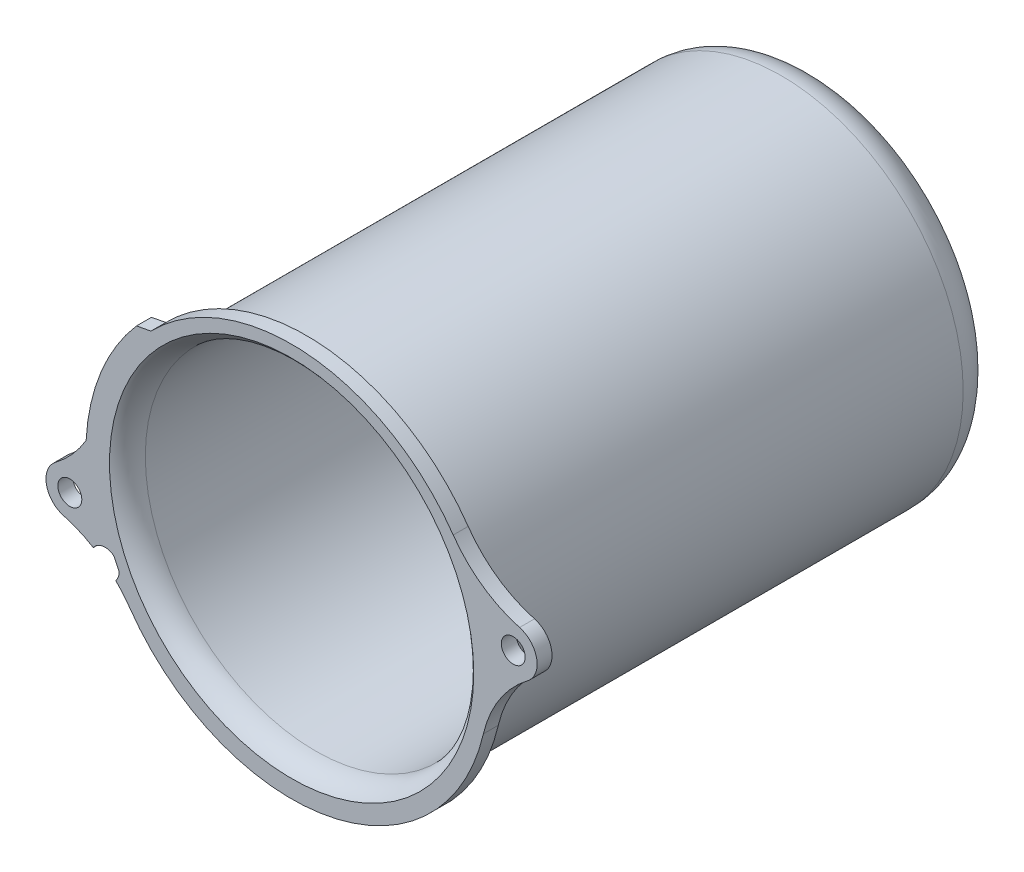
ISO-10303-21;
HEADER;
FILE_DESCRIPTION(('STEP AP214'),'2;1');
FILE_NAME('part.step','',(''),(''),'','','');
FILE_SCHEMA(('AUTOMOTIVE_DESIGN { 1 0 10303 214 1 1 1 1 }'));
ENDSEC;
DATA;
#1=APPLICATION_CONTEXT('core data for automotive mechanical design processes');
#2=APPLICATION_PROTOCOL_DEFINITION('international standard','automotive_design',2000,#1);
#3=PRODUCT_CONTEXT('',#1,'mechanical');
#4=PRODUCT('Part','Part','',(#3));
#5=PRODUCT_RELATED_PRODUCT_CATEGORY('part','',(#4));
#6=PRODUCT_DEFINITION_FORMATION('','',#4);
#7=PRODUCT_DEFINITION_CONTEXT('part definition',#1,'design');
#8=PRODUCT_DEFINITION('design','',#6,#7);
#9=PRODUCT_DEFINITION_SHAPE('','',#8);
#10=(LENGTH_UNIT() NAMED_UNIT(*) SI_UNIT(.MILLI.,.METRE.));
#11=(NAMED_UNIT(*) PLANE_ANGLE_UNIT() SI_UNIT($,.RADIAN.));
#12=(NAMED_UNIT(*) SI_UNIT($,.STERADIAN.) SOLID_ANGLE_UNIT());
#13=UNCERTAINTY_MEASURE_WITH_UNIT(LENGTH_MEASURE(1.E-05),#10,'distance_accuracy_value','');
#14=(GEOMETRIC_REPRESENTATION_CONTEXT(3) GLOBAL_UNCERTAINTY_ASSIGNED_CONTEXT((#13)) GLOBAL_UNIT_ASSIGNED_CONTEXT((#10,
#11,#12)) REPRESENTATION_CONTEXT('',''));
#15=CARTESIAN_POINT('',(0.,0.,0.));
#16=DIRECTION('',(0.,0.,1.));
#17=DIRECTION('',(1.,0.,0.));
#18=AXIS2_PLACEMENT_3D('',#15,#16,#17);
#19=CARTESIAN_POINT('',(37.1314984061191,7.1452296563436,0.));
#20=DIRECTION('',(0.,0.,1.));
#21=DIRECTION('',(1.,0.,0.));
#22=AXIS2_PLACEMENT_3D('',#19,#20,#21);
#23=PLANE('',#22);
#24=CARTESIAN_POINT('',(-37.1557425862573,-7.11096578016195,0.));
#25=DIRECTION('',(0.,0.,-1.));
#26=DIRECTION('',(-1.,0.,0.));
#27=AXIS2_PLACEMENT_3D('',#24,#25,#26);
#28=CIRCLE('',#27,2.);
#29=CARTESIAN_POINT('',(-39.1557425862573,-7.11096578016195,0.));
#30=VERTEX_POINT('',#29);
#31=EDGE_CURVE('E171',#30,#30,#28,.T.);
#32=ORIENTED_EDGE('',*,*,#31,.F.);
#33=EDGE_LOOP('',(#32));
#34=FACE_BOUND('',#33,.T.);
#35=CARTESIAN_POINT('',(37.1314984061191,7.1452296563436,0.));
#36=DIRECTION('',(0.,0.,1.));
#37=DIRECTION('',(1.,0.,0.));
#38=AXIS2_PLACEMENT_3D('',#35,#36,#37);
#39=CIRCLE('',#38,2.);
#40=CARTESIAN_POINT('',(39.1314984061191,7.1452296563436,0.));
#41=VERTEX_POINT('',#40);
#42=EDGE_CURVE('E159',#41,#41,#39,.T.);
#43=ORIENTED_EDGE('',*,*,#42,.T.);
#44=EDGE_LOOP('',(#43));
#45=FACE_BOUND('',#44,.T.);
#46=CARTESIAN_POINT('',(-31.2603609977853,-14.448814942743,0.));
#47=DIRECTION('',(0.,0.,1.));
#48=DIRECTION('',(1.,0.,0.));
#49=AXIS2_PLACEMENT_3D('',#46,#47,#48);
#50=CIRCLE('',#49,2.37047257493352);
#51=CARTESIAN_POINT('',(-29.4766622936871,-16.0100833890746,0.));
#52=VERTEX_POINT('',#51);
#53=CARTESIAN_POINT('',(-28.8900823285085,-14.4184956669679,0.));
#54=VERTEX_POINT('',#53);
#55=EDGE_CURVE('E197',#52,#54,#50,.T.);
#56=ORIENTED_EDGE('',*,*,#55,.T.);
#57=CARTESIAN_POINT('',(0.,0.490000000000017,0.));
#58=DIRECTION('',(0.,0.,1.));
#59=DIRECTION('',(1.,0.,0.));
#60=AXIS2_PLACEMENT_3D('',#57,#58,#59);
#61=CIRCLE('',#60,32.51);
#62=CARTESIAN_POINT('',(-29.7478317506265,-12.6236038576897,0.));
#63=VERTEX_POINT('',#62);
#64=EDGE_CURVE('E156',#63,#54,#61,.T.);
#65=ORIENTED_EDGE('',*,*,#64,.F.);
#66=CARTESIAN_POINT('',(-33.216253111935,-13.1095516130282,0.));
#67=VERTEX_POINT('',#66);
#68=EDGE_CURVE('E49',#63,#67,#50,.T.);
#69=ORIENTED_EDGE('',*,*,#68,.T.);
#70=CARTESIAN_POINT('',(-43.517994945261,-30.2523085441494,0.));
#71=DIRECTION('',(0.,0.,-1.));
#72=DIRECTION('',(-1.,0.,0.));
#73=AXIS2_PLACEMENT_3D('',#70,#71,#72);
#74=CIRCLE('',#73,20.);
#75=CARTESIAN_POINT('',(-38.2161179794246,-10.9678562408265,0.));
#76=VERTEX_POINT('',#75);
#77=EDGE_CURVE('E196',#76,#67,#74,.T.);
#78=ORIENTED_EDGE('',*,*,#77,.F.);
#79=CARTESIAN_POINT('',(-37.1557425862573,-7.11096578016195,0.));
#80=DIRECTION('',(0.,0.,-1.));
#81=DIRECTION('',(-1.,0.,0.));
#82=AXIS2_PLACEMENT_3D('',#79,#80,#81);
#83=CIRCLE('',#82,4.00000000000001);
#84=CARTESIAN_POINT('',(-39.5685318355066,-3.9205977702441,0.));
#85=VERTEX_POINT('',#84);
#86=EDGE_CURVE('E193',#76,#85,#83,.T.);
#87=ORIENTED_EDGE('',*,*,#86,.T.);
#88=CARTESIAN_POINT('',(-51.632478081753,12.0312422793451,0.));
#89=DIRECTION('',(0.,0.,1.));
#90=DIRECTION('',(1.,0.,0.));
#91=AXIS2_PLACEMENT_3D('',#88,#89,#90);
#92=CIRCLE('',#91,20.);
#93=CARTESIAN_POINT('',(-34.4270577265697,1.83450209429344,0.));
#94=VERTEX_POINT('',#93);
#95=EDGE_CURVE('E190',#85,#94,#92,.T.);
#96=ORIENTED_EDGE('',*,*,#95,.T.);
#97=CARTESIAN_POINT('',(-0.0121220900691226,0.0171319380908276,0.));
#98=DIRECTION('',(0.,0.,1.));
#99=DIRECTION('',(1.,0.,0.));
#100=AXIS2_PLACEMENT_3D('',#97,#98,#99);
#101=CIRCLE('',#100,34.4628877076361);
#102=CARTESIAN_POINT('',(-25.9858462517282,22.667877672463,0.));
#103=VERTEX_POINT('',#102);
#104=EDGE_CURVE('E187',#103,#94,#101,.T.);
#105=ORIENTED_EDGE('',*,*,#104,.F.);
#106=DIRECTION('',(-0.982414788855159,-0.186711495732516,0.));
#107=VECTOR('',#106,1.);
#108=CARTESIAN_POINT('',(-23.568944798703,23.1272185643671,0.));
#109=LINE('',#108,#107);
#110=CARTESIAN_POINT('',(-23.568944798703,23.1272185643671,0.));
#111=VERTEX_POINT('',#110);
#112=EDGE_CURVE('E184',#111,#103,#109,.T.);
#113=ORIENTED_EDGE('',*,*,#112,.F.);
#114=CARTESIAN_POINT('',(-0.0121220900691226,0.0171319380908276,0.));
#115=DIRECTION('',(0.,0.,1.));
#116=DIRECTION('',(1.,0.,0.));
#117=AXIS2_PLACEMENT_3D('',#114,#115,#116);
#118=CIRCLE('',#117,33.);
#119=CARTESIAN_POINT('',(27.0764402537296,18.8641420496743,0.));
#120=VERTEX_POINT('',#119);
#121=EDGE_CURVE('E183',#120,#111,#118,.T.);
#122=ORIENTED_EDGE('',*,*,#121,.F.);
#123=CARTESIAN_POINT('',(43.4937507651227,30.286572420331,0.));
#124=DIRECTION('',(0.,0.,-1.));
#125=DIRECTION('',(-1.,0.,0.));
#126=AXIS2_PLACEMENT_3D('',#123,#124,#125);
#127=CIRCLE('',#126,20.);
#128=CARTESIAN_POINT('',(38.1918737992863,11.0021201170082,0.));
#129=VERTEX_POINT('',#128);
#130=EDGE_CURVE('E180',#129,#120,#127,.T.);
#131=ORIENTED_EDGE('',*,*,#130,.F.);
#132=CARTESIAN_POINT('',(37.1314984061191,7.1452296563436,0.));
#133=DIRECTION('',(0.,0.,1.));
#134=DIRECTION('',(1.,0.,0.));
#135=AXIS2_PLACEMENT_3D('',#132,#133,#134);
#136=CIRCLE('',#135,4.00000000000001);
#137=CARTESIAN_POINT('',(39.5442876553683,3.95486164642576,0.));
#138=VERTEX_POINT('',#137);
#139=EDGE_CURVE('E177',#138,#129,#136,.T.);
#140=ORIENTED_EDGE('',*,*,#139,.F.);
#141=CARTESIAN_POINT('',(51.6082339016147,-11.9969784031634,0.));
#142=DIRECTION('',(0.,0.,1.));
#143=DIRECTION('',(1.,0.,0.));
#144=AXIS2_PLACEMENT_3D('',#141,#142,#143);
#145=CIRCLE('',#144,20.);
#146=CARTESIAN_POINT('',(32.1288542821114,-7.46335185929391,0.));
#147=VERTEX_POINT('',#146);
#148=EDGE_CURVE('E205',#138,#147,#145,.T.);
#149=ORIENTED_EDGE('',*,*,#148,.T.);
#150=CARTESIAN_POINT('',(-27.1006844338678,-18.8298781734927,0.));
#151=VERTEX_POINT('',#150);
#152=EDGE_CURVE('E202',#151,#147,#118,.T.);
#153=ORIENTED_EDGE('',*,*,#152,.F.);
#154=EDGE_CURVE('E199',#52,#151,#74,.T.);
#155=ORIENTED_EDGE('',*,*,#154,.F.);
#156=EDGE_LOOP('',(#56,#65,#69,#78,#87,#96,#105,#113,#122,#131,#140,#149,#153,#155));
#157=FACE_BOUND('',#156,.T.);
#158=CARTESIAN_POINT('',(0.,0.490000000000018,0.));
#159=DIRECTION('',(0.,0.,1.));
#160=DIRECTION('',(1.,0.,0.));
#161=AXIS2_PLACEMENT_3D('',#158,#159,#160);
#162=CIRCLE('',#161,32.01);
#163=CARTESIAN_POINT('',(32.01,0.490000000000018,0.));
#164=VERTEX_POINT('',#163);
#165=EDGE_CURVE('E11',#164,#164,#162,.F.);
#166=ORIENTED_EDGE('',*,*,#165,.F.);
#167=EDGE_LOOP('',(#166));
#168=FACE_BOUND('',#167,.T.);
#169=ADVANCED_FACE('F34',(#34,#45,#157,#168),#23,.F.);
#170=CARTESIAN_POINT('',(-31.2603609977853,-14.448814942743,2.5));
#171=DIRECTION('',(0.,0.,-1.));
#172=DIRECTION('',(-1.,0.,0.));
#173=AXIS2_PLACEMENT_3D('',#170,#171,#172);
#174=CYLINDRICAL_SURFACE('',#173,2.37047257493352);
#175=CARTESIAN_POINT('',(-31.2603609977853,-14.448814942743,2.5));
#176=DIRECTION('',(0.,0.,1.));
#177=DIRECTION('',(1.,0.,0.));
#178=AXIS2_PLACEMENT_3D('',#175,#176,#177);
#179=CIRCLE('',#178,2.37047257493352);
#180=CARTESIAN_POINT('',(-29.4766622936871,-16.0100833890746,2.5));
#181=VERTEX_POINT('',#180);
#182=CARTESIAN_POINT('',(-28.8900823285085,-14.4184956669679,2.5));
#183=VERTEX_POINT('',#182);
#184=EDGE_CURVE('E146',#181,#183,#179,.T.);
#185=ORIENTED_EDGE('',*,*,#184,.T.);
#186=DIRECTION('',(0.,0.,1.));
#187=VECTOR('',#186,1.);
#188=CARTESIAN_POINT('',(-28.8900823285085,-14.4184956669679,1.24999999999998));
#189=LINE('',#188,#187);
#190=EDGE_CURVE('E42',#183,#54,#189,.F.);
#191=ORIENTED_EDGE('',*,*,#190,.T.);
#192=ORIENTED_EDGE('',*,*,#55,.F.);
#193=DIRECTION('',(0.,0.,-1.));
#194=VECTOR('',#193,1.);
#195=CARTESIAN_POINT('',(-29.4766622936871,-16.0100833890746,2.5));
#196=LINE('',#195,#194);
#197=EDGE_CURVE('E242',#181,#52,#196,.T.);
#198=ORIENTED_EDGE('',*,*,#197,.F.);
#199=EDGE_LOOP('',(#185,#191,#192,#198));
#200=FACE_BOUND('',#199,.T.);
#201=ADVANCED_FACE('F288',(#200),#174,.F.);
#202=ORIENTED_EDGE('',*,*,#68,.F.);
#203=DIRECTION('',(0.,0.,1.));
#204=VECTOR('',#203,1.);
#205=CARTESIAN_POINT('',(-29.7478317506265,-12.6236038576897,1.24999999999998));
#206=LINE('',#205,#204);
#207=CARTESIAN_POINT('',(-29.7478317506266,-12.6236038576897,2.49999999999997));
#208=VERTEX_POINT('',#207);
#209=EDGE_CURVE('E148',#63,#208,#206,.T.);
#210=ORIENTED_EDGE('',*,*,#209,.T.);
#211=CARTESIAN_POINT('',(-33.216253111935,-13.1095516130282,2.5));
#212=VERTEX_POINT('',#211);
#213=EDGE_CURVE('E136',#208,#212,#179,.T.);
#214=ORIENTED_EDGE('',*,*,#213,.T.);
#215=DIRECTION('',(0.,0.,-1.));
#216=VECTOR('',#215,1.);
#217=CARTESIAN_POINT('',(-33.216253111935,-13.1095516130282,2.5));
#218=LINE('',#217,#216);
#219=EDGE_CURVE('E244',#212,#67,#218,.T.);
#220=ORIENTED_EDGE('',*,*,#219,.T.);
#221=EDGE_LOOP('',(#202,#210,#214,#220));
#222=FACE_BOUND('',#221,.T.);
#223=ADVANCED_FACE('F149',(#222),#174,.F.);
#224=CARTESIAN_POINT('',(37.1314984061191,7.1452296563436,2.5));
#225=DIRECTION('',(0.,0.,1.));
#226=DIRECTION('',(1.,0.,0.));
#227=AXIS2_PLACEMENT_3D('',#224,#225,#226);
#228=PLANE('',#227);
#229=CARTESIAN_POINT('',(0.,0.490000000000017,2.49999999999997));
#230=DIRECTION('',(0.,0.,1.));
#231=DIRECTION('',(1.,0.,0.));
#232=AXIS2_PLACEMENT_3D('',#229,#230,#231);
#233=CIRCLE('',#232,32.51);
#234=EDGE_CURVE('E141',#208,#183,#233,.T.);
#235=ORIENTED_EDGE('',*,*,#234,.T.);
#236=ORIENTED_EDGE('',*,*,#184,.F.);
#237=CARTESIAN_POINT('',(-43.517994945261,-30.2523085441494,2.5));
#238=DIRECTION('',(0.,0.,-1.));
#239=DIRECTION('',(-1.,0.,0.));
#240=AXIS2_PLACEMENT_3D('',#237,#238,#239);
#241=CIRCLE('',#240,20.);
#242=CARTESIAN_POINT('',(-27.1006844338678,-18.8298781734927,2.5));
#243=VERTEX_POINT('',#242);
#244=EDGE_CURVE('E227',#181,#243,#241,.T.);
#245=ORIENTED_EDGE('',*,*,#244,.T.);
#246=CARTESIAN_POINT('',(-0.0121220900691226,0.0171319380908276,2.5));
#247=DIRECTION('',(0.,0.,1.));
#248=DIRECTION('',(1.,0.,0.));
#249=AXIS2_PLACEMENT_3D('',#246,#247,#248);
#250=CIRCLE('',#249,33.);
#251=CARTESIAN_POINT('',(32.1288542821114,-7.46335185929391,2.5));
#252=VERTEX_POINT('',#251);
#253=EDGE_CURVE('E230',#243,#252,#250,.T.);
#254=ORIENTED_EDGE('',*,*,#253,.T.);
#255=CARTESIAN_POINT('',(51.6082339016147,-11.9969784031634,2.5));
#256=DIRECTION('',(0.,0.,1.));
#257=DIRECTION('',(1.,0.,0.));
#258=AXIS2_PLACEMENT_3D('',#255,#256,#257);
#259=CIRCLE('',#258,20.);
#260=CARTESIAN_POINT('',(39.5442876553683,3.95486164642576,2.5));
#261=VERTEX_POINT('',#260);
#262=EDGE_CURVE('E233',#261,#252,#259,.T.);
#263=ORIENTED_EDGE('',*,*,#262,.F.);
#264=CARTESIAN_POINT('',(37.1314984061191,7.1452296563436,2.5));
#265=DIRECTION('',(0.,0.,1.));
#266=DIRECTION('',(1.,0.,0.));
#267=AXIS2_PLACEMENT_3D('',#264,#265,#266);
#268=CIRCLE('',#267,4.00000000000001);
#269=CARTESIAN_POINT('',(38.1918737992863,11.0021201170082,2.5));
#270=VERTEX_POINT('',#269);
#271=EDGE_CURVE('E208',#261,#270,#268,.T.);
#272=ORIENTED_EDGE('',*,*,#271,.T.);
#273=CARTESIAN_POINT('',(43.4937507651227,30.286572420331,2.5));
#274=DIRECTION('',(0.,0.,-1.));
#275=DIRECTION('',(-1.,0.,0.));
#276=AXIS2_PLACEMENT_3D('',#273,#274,#275);
#277=CIRCLE('',#276,20.);
#278=CARTESIAN_POINT('',(27.0764402537296,18.8641420496743,2.5));
#279=VERTEX_POINT('',#278);
#280=EDGE_CURVE('E211',#270,#279,#277,.T.);
#281=ORIENTED_EDGE('',*,*,#280,.T.);
#282=CARTESIAN_POINT('',(-23.568944798703,23.1272185643671,2.5));
#283=VERTEX_POINT('',#282);
#284=EDGE_CURVE('E214',#279,#283,#250,.T.);
#285=ORIENTED_EDGE('',*,*,#284,.T.);
#286=DIRECTION('',(-0.982414788855159,-0.186711495732516,0.));
#287=VECTOR('',#286,1.);
#288=CARTESIAN_POINT('',(-23.568944798703,23.1272185643671,2.5));
#289=LINE('',#288,#287);
#290=CARTESIAN_POINT('',(-25.9858462517282,22.667877672463,2.5));
#291=VERTEX_POINT('',#290);
#292=EDGE_CURVE('E215',#283,#291,#289,.T.);
#293=ORIENTED_EDGE('',*,*,#292,.T.);
#294=CARTESIAN_POINT('',(-0.0121220900691226,0.0171319380908276,2.5));
#295=DIRECTION('',(0.,0.,1.));
#296=DIRECTION('',(1.,0.,0.));
#297=AXIS2_PLACEMENT_3D('',#294,#295,#296);
#298=CIRCLE('',#297,34.4628877076361);
#299=CARTESIAN_POINT('',(-34.4270577265697,1.83450209429344,2.5));
#300=VERTEX_POINT('',#299);
#301=EDGE_CURVE('E218',#291,#300,#298,.T.);
#302=ORIENTED_EDGE('',*,*,#301,.T.);
#303=CARTESIAN_POINT('',(-51.632478081753,12.0312422793451,2.5));
#304=DIRECTION('',(0.,0.,1.));
#305=DIRECTION('',(1.,0.,0.));
#306=AXIS2_PLACEMENT_3D('',#303,#304,#305);
#307=CIRCLE('',#306,20.);
#308=CARTESIAN_POINT('',(-39.5685318355066,-3.9205977702441,2.5));
#309=VERTEX_POINT('',#308);
#310=EDGE_CURVE('E221',#309,#300,#307,.T.);
#311=ORIENTED_EDGE('',*,*,#310,.F.);
#312=CARTESIAN_POINT('',(-37.1557425862573,-7.11096578016195,2.5));
#313=DIRECTION('',(0.,0.,-1.));
#314=DIRECTION('',(-1.,0.,0.));
#315=AXIS2_PLACEMENT_3D('',#312,#313,#314);
#316=CIRCLE('',#315,4.00000000000001);
#317=CARTESIAN_POINT('',(-38.2161179794246,-10.9678562408265,2.5));
#318=VERTEX_POINT('',#317);
#319=EDGE_CURVE('E224',#318,#309,#316,.T.);
#320=ORIENTED_EDGE('',*,*,#319,.F.);
#321=EDGE_CURVE('E144',#318,#212,#241,.T.);
#322=ORIENTED_EDGE('',*,*,#321,.T.);
#323=ORIENTED_EDGE('',*,*,#213,.F.);
#324=EDGE_LOOP('',(#235,#236,#245,#254,#263,#272,#281,#285,#293,#302,#311,#320,#322,#323));
#325=FACE_BOUND('',#324,.T.);
#326=CARTESIAN_POINT('',(0.,0.490000000000017,2.49999999999997));
#327=DIRECTION('',(0.,0.,1.));
#328=DIRECTION('',(1.,0.,0.));
#329=AXIS2_PLACEMENT_3D('',#326,#327,#328);
#330=CIRCLE('',#329,30.51);
#331=CARTESIAN_POINT('',(30.51,0.490000000000017,2.49999999999997));
#332=VERTEX_POINT('',#331);
#333=EDGE_CURVE('E157',#332,#332,#330,.T.);
#334=ORIENTED_EDGE('',*,*,#333,.F.);
#335=EDGE_LOOP('',(#334));
#336=FACE_BOUND('',#335,.T.);
#337=CARTESIAN_POINT('',(-37.1557425862573,-7.11096578016195,2.5));
#338=DIRECTION('',(0.,0.,-1.));
#339=DIRECTION('',(-1.,0.,0.));
#340=AXIS2_PLACEMENT_3D('',#337,#338,#339);
#341=CIRCLE('',#340,2.);
#342=CARTESIAN_POINT('',(-39.1557425862573,-7.11096578016195,2.5));
#343=VERTEX_POINT('',#342);
#344=EDGE_CURVE('E174',#343,#343,#341,.T.);
#345=ORIENTED_EDGE('',*,*,#344,.T.);
#346=EDGE_LOOP('',(#345));
#347=FACE_BOUND('',#346,.T.);
#348=CARTESIAN_POINT('',(37.1314984061191,7.1452296563436,2.5));
#349=DIRECTION('',(0.,0.,1.));
#350=DIRECTION('',(1.,0.,0.));
#351=AXIS2_PLACEMENT_3D('',#348,#349,#350);
#352=CIRCLE('',#351,2.);
#353=CARTESIAN_POINT('',(39.1314984061191,7.1452296563436,2.5));
#354=VERTEX_POINT('',#353);
#355=EDGE_CURVE('E168',#354,#354,#352,.T.);
#356=ORIENTED_EDGE('',*,*,#355,.F.);
#357=EDGE_LOOP('',(#356));
#358=FACE_BOUND('',#357,.T.);
#359=ADVANCED_FACE('F137',(#325,#336,#347,#358),#228,.T.);
#360=CARTESIAN_POINT('',(37.1314984061191,7.1452296563436,2.5));
#361=DIRECTION('',(0.,0.,-1.));
#362=DIRECTION('',(-1.,0.,0.));
#363=AXIS2_PLACEMENT_3D('',#360,#361,#362);
#364=CYLINDRICAL_SURFACE('',#363,4.00000000000001);
#365=DIRECTION('',(0.,0.,-1.));
#366=VECTOR('',#365,1.);
#367=CARTESIAN_POINT('',(38.1918737992863,11.0021201170082,2.5));
#368=LINE('',#367,#366);
#369=EDGE_CURVE('E153',#270,#129,#368,.T.);
#370=ORIENTED_EDGE('',*,*,#369,.F.);
#371=ORIENTED_EDGE('',*,*,#271,.F.);
#372=DIRECTION('',(0.,0.,-1.));
#373=VECTOR('',#372,1.);
#374=CARTESIAN_POINT('',(39.5442876553683,3.95486164642576,2.5));
#375=LINE('',#374,#373);
#376=EDGE_CURVE('E236',#261,#138,#375,.T.);
#377=ORIENTED_EDGE('',*,*,#376,.T.);
#378=ORIENTED_EDGE('',*,*,#139,.T.);
#379=EDGE_LOOP('',(#370,#371,#377,#378));
#380=FACE_BOUND('',#379,.T.);
#381=ADVANCED_FACE('F265',(#380),#364,.T.);
#382=CARTESIAN_POINT('',(43.4937507651227,30.286572420331,2.5));
#383=DIRECTION('',(0.,0.,-1.));
#384=DIRECTION('',(-1.,0.,0.));
#385=AXIS2_PLACEMENT_3D('',#382,#383,#384);
#386=CYLINDRICAL_SURFACE('',#385,20.);
#387=DIRECTION('',(0.,0.,-1.));
#388=VECTOR('',#387,1.);
#389=CARTESIAN_POINT('',(27.0764402537296,18.8641420496743,2.5));
#390=LINE('',#389,#388);
#391=EDGE_CURVE('E256',#279,#120,#390,.T.);
#392=ORIENTED_EDGE('',*,*,#391,.F.);
#393=ORIENTED_EDGE('',*,*,#280,.F.);
#394=ORIENTED_EDGE('',*,*,#369,.T.);
#395=ORIENTED_EDGE('',*,*,#130,.T.);
#396=EDGE_LOOP('',(#392,#393,#394,#395));
#397=FACE_BOUND('',#396,.T.);
#398=ADVANCED_FACE('F36',(#397),#386,.F.);
#399=CARTESIAN_POINT('',(-0.0121220900691226,0.0171319380908276,2.5));
#400=DIRECTION('',(0.,0.,-1.));
#401=DIRECTION('',(-1.,0.,0.));
#402=AXIS2_PLACEMENT_3D('',#399,#400,#401);
#403=CYLINDRICAL_SURFACE('',#402,33.);
#404=DIRECTION('',(0.,0.,-1.));
#405=VECTOR('',#404,1.);
#406=CARTESIAN_POINT('',(-23.568944798703,23.1272185643671,2.5));
#407=LINE('',#406,#405);
#408=EDGE_CURVE('E254',#283,#111,#407,.T.);
#409=ORIENTED_EDGE('',*,*,#408,.F.);
#410=ORIENTED_EDGE('',*,*,#284,.F.);
#411=ORIENTED_EDGE('',*,*,#391,.T.);
#412=ORIENTED_EDGE('',*,*,#121,.T.);
#413=EDGE_LOOP('',(#409,#410,#411,#412));
#414=FACE_BOUND('',#413,.T.);
#415=ADVANCED_FACE('F273',(#414),#403,.T.);
#416=CARTESIAN_POINT('',(-23.568944798703,23.1272185643671,2.5));
#417=DIRECTION('',(0.186711495732516,-0.982414788855159,0.));
#418=DIRECTION('',(0.982414788855159,0.186711495732516,0.));
#419=AXIS2_PLACEMENT_3D('',#416,#417,#418);
#420=PLANE('',#419);
#421=DIRECTION('',(0.,0.,-1.));
#422=VECTOR('',#421,1.);
#423=CARTESIAN_POINT('',(-25.9858462517282,22.667877672463,2.5));
#424=LINE('',#423,#422);
#425=EDGE_CURVE('E252',#291,#103,#424,.T.);
#426=ORIENTED_EDGE('',*,*,#425,.F.);
#427=ORIENTED_EDGE('',*,*,#292,.F.);
#428=ORIENTED_EDGE('',*,*,#408,.T.);
#429=ORIENTED_EDGE('',*,*,#112,.T.);
#430=EDGE_LOOP('',(#426,#427,#428,#429));
#431=FACE_BOUND('',#430,.T.);
#432=ADVANCED_FACE('F304',(#431),#420,.F.);
#433=CARTESIAN_POINT('',(-0.0121220900691226,0.0171319380908276,2.5));
#434=DIRECTION('',(0.,0.,-1.));
#435=DIRECTION('',(-1.,0.,0.));
#436=AXIS2_PLACEMENT_3D('',#433,#434,#435);
#437=CYLINDRICAL_SURFACE('',#436,34.4628877076361);
#438=DIRECTION('',(0.,0.,-1.));
#439=VECTOR('',#438,1.);
#440=CARTESIAN_POINT('',(-34.4270577265697,1.83450209429344,2.5));
#441=LINE('',#440,#439);
#442=EDGE_CURVE('E250',#300,#94,#441,.T.);
#443=ORIENTED_EDGE('',*,*,#442,.F.);
#444=ORIENTED_EDGE('',*,*,#301,.F.);
#445=ORIENTED_EDGE('',*,*,#425,.T.);
#446=ORIENTED_EDGE('',*,*,#104,.T.);
#447=EDGE_LOOP('',(#443,#444,#445,#446));
#448=FACE_BOUND('',#447,.T.);
#449=ADVANCED_FACE('F302',(#448),#437,.T.);
#450=CARTESIAN_POINT('',(-51.632478081753,12.0312422793451,2.5));
#451=DIRECTION('',(0.,0.,-1.));
#452=DIRECTION('',(-1.,0.,0.));
#453=AXIS2_PLACEMENT_3D('',#450,#451,#452);
#454=CYLINDRICAL_SURFACE('',#453,20.);
#455=DIRECTION('',(0.,0.,-1.));
#456=VECTOR('',#455,1.);
#457=CARTESIAN_POINT('',(-39.5685318355066,-3.9205977702441,2.5));
#458=LINE('',#457,#456);
#459=EDGE_CURVE('E248',#309,#85,#458,.T.);
#460=ORIENTED_EDGE('',*,*,#459,.F.);
#461=ORIENTED_EDGE('',*,*,#310,.T.);
#462=ORIENTED_EDGE('',*,*,#442,.T.);
#463=ORIENTED_EDGE('',*,*,#95,.F.);
#464=EDGE_LOOP('',(#460,#461,#462,#463));
#465=FACE_BOUND('',#464,.T.);
#466=ADVANCED_FACE('F298',(#465),#454,.F.);
#467=CARTESIAN_POINT('',(-37.1557425862573,-7.11096578016195,2.5));
#468=DIRECTION('',(0.,0.,-1.));
#469=DIRECTION('',(-1.,0.,0.));
#470=AXIS2_PLACEMENT_3D('',#467,#468,#469);
#471=CYLINDRICAL_SURFACE('',#470,4.00000000000001);
#472=DIRECTION('',(0.,0.,-1.));
#473=VECTOR('',#472,1.);
#474=CARTESIAN_POINT('',(-38.2161179794246,-10.9678562408265,2.5));
#475=LINE('',#474,#473);
#476=EDGE_CURVE('E246',#318,#76,#475,.T.);
#477=ORIENTED_EDGE('',*,*,#476,.F.);
#478=ORIENTED_EDGE('',*,*,#319,.T.);
#479=ORIENTED_EDGE('',*,*,#459,.T.);
#480=ORIENTED_EDGE('',*,*,#86,.F.);
#481=EDGE_LOOP('',(#477,#478,#479,#480));
#482=FACE_BOUND('',#481,.T.);
#483=ADVANCED_FACE('F295',(#482),#471,.T.);
#484=CARTESIAN_POINT('',(-43.517994945261,-30.2523085441494,2.5));
#485=DIRECTION('',(0.,0.,-1.));
#486=DIRECTION('',(-1.,0.,0.));
#487=AXIS2_PLACEMENT_3D('',#484,#485,#486);
#488=CYLINDRICAL_SURFACE('',#487,20.);
#489=ORIENTED_EDGE('',*,*,#219,.F.);
#490=ORIENTED_EDGE('',*,*,#321,.F.);
#491=ORIENTED_EDGE('',*,*,#476,.T.);
#492=ORIENTED_EDGE('',*,*,#77,.T.);
#493=EDGE_LOOP('',(#489,#490,#491,#492));
#494=FACE_BOUND('',#493,.T.);
#495=ADVANCED_FACE('F292',(#494),#488,.F.);
#496=DIRECTION('',(0.,0.,-1.));
#497=VECTOR('',#496,1.);
#498=CARTESIAN_POINT('',(-27.1006844338678,-18.8298781734927,2.5));
#499=LINE('',#498,#497);
#500=EDGE_CURVE('E240',#243,#151,#499,.T.);
#501=ORIENTED_EDGE('',*,*,#500,.F.);
#502=ORIENTED_EDGE('',*,*,#244,.F.);
#503=ORIENTED_EDGE('',*,*,#197,.T.);
#504=ORIENTED_EDGE('',*,*,#154,.T.);
#505=EDGE_LOOP('',(#501,#502,#503,#504));
#506=FACE_BOUND('',#505,.T.);
#507=ADVANCED_FACE('F287',(#506),#488,.F.);
#508=DIRECTION('',(0.,0.,-1.));
#509=VECTOR('',#508,1.);
#510=CARTESIAN_POINT('',(32.1288542821114,-7.46335185929391,2.5));
#511=LINE('',#510,#509);
#512=EDGE_CURVE('E238',#252,#147,#511,.T.);
#513=ORIENTED_EDGE('',*,*,#512,.F.);
#514=ORIENTED_EDGE('',*,*,#253,.F.);
#515=ORIENTED_EDGE('',*,*,#500,.T.);
#516=ORIENTED_EDGE('',*,*,#152,.T.);
#517=EDGE_LOOP('',(#513,#514,#515,#516));
#518=FACE_BOUND('',#517,.T.);
#519=ADVANCED_FACE('F284',(#518),#403,.T.);
#520=CARTESIAN_POINT('',(51.6082339016147,-11.9969784031634,2.5));
#521=DIRECTION('',(0.,0.,-1.));
#522=DIRECTION('',(-1.,0.,0.));
#523=AXIS2_PLACEMENT_3D('',#520,#521,#522);
#524=CYLINDRICAL_SURFACE('',#523,20.);
#525=ORIENTED_EDGE('',*,*,#262,.T.);
#526=ORIENTED_EDGE('',*,*,#512,.T.);
#527=ORIENTED_EDGE('',*,*,#148,.F.);
#528=ORIENTED_EDGE('',*,*,#376,.F.);
#529=EDGE_LOOP('',(#525,#526,#527,#528));
#530=FACE_BOUND('',#529,.T.);
#531=ADVANCED_FACE('F280',(#530),#524,.F.);
#532=CARTESIAN_POINT('',(-37.1557425862573,-7.11096578016195,2.5));
#533=DIRECTION('',(0.,0.,-1.));
#534=DIRECTION('',(-1.,0.,0.));
#535=AXIS2_PLACEMENT_3D('',#532,#533,#534);
#536=CYLINDRICAL_SURFACE('',#535,2.);
#537=ORIENTED_EDGE('',*,*,#344,.F.);
#538=EDGE_LOOP('',(#537));
#539=FACE_BOUND('',#538,.T.);
#540=ORIENTED_EDGE('',*,*,#31,.T.);
#541=EDGE_LOOP('',(#540));
#542=FACE_BOUND('',#541,.T.);
#543=ADVANCED_FACE('F323',(#539,#542),#536,.F.);
#544=CARTESIAN_POINT('',(37.1314984061191,7.1452296563436,2.5));
#545=DIRECTION('',(0.,0.,-1.));
#546=DIRECTION('',(-1.,0.,0.));
#547=AXIS2_PLACEMENT_3D('',#544,#545,#546);
#548=CYLINDRICAL_SURFACE('',#547,2.);
#549=ORIENTED_EDGE('',*,*,#355,.T.);
#550=EDGE_LOOP('',(#549));
#551=FACE_BOUND('',#550,.T.);
#552=ORIENTED_EDGE('',*,*,#42,.F.);
#553=EDGE_LOOP('',(#552));
#554=FACE_BOUND('',#553,.T.);
#555=ADVANCED_FACE('F368',(#551,#554),#548,.F.);
#556=CARTESIAN_POINT('',(0.,0.490000000000017,-0.231281164226195));
#557=DIRECTION('',(0.,0.,1.));
#558=DIRECTION('',(1.,0.,0.));
#559=AXIS2_PLACEMENT_3D('',#556,#557,#558);
#560=CYLINDRICAL_SURFACE('',#559,30.5099999999999);
#561=CARTESIAN_POINT('',(0.,0.490000000000017,-79.4999999999999));
#562=DIRECTION('',(0.,0.,1.));
#563=DIRECTION('',(1.,0.,0.));
#564=AXIS2_PLACEMENT_3D('',#561,#562,#563);
#565=CIRCLE('',#564,30.51);
#566=CARTESIAN_POINT('',(30.51,0.490000000000017,-79.4999999999999));
#567=VERTEX_POINT('',#566);
#568=EDGE_CURVE('E645',#567,#567,#565,.T.);
#569=ORIENTED_EDGE('',*,*,#568,.T.);
#570=EDGE_LOOP('',(#569));
#571=FACE_BOUND('',#570,.T.);
#572=CARTESIAN_POINT('',(0.,0.490000000000017,-1.49999999999999));
#573=DIRECTION('',(0.,0.,1.));
#574=DIRECTION('',(1.,0.,0.));
#575=AXIS2_PLACEMENT_3D('',#572,#573,#574);
#576=CIRCLE('',#575,30.5099999999999);
#577=CARTESIAN_POINT('',(30.5099999999999,0.490000000000017,-1.49999999999999));
#578=VERTEX_POINT('',#577);
#579=EDGE_CURVE('E642',#578,#578,#576,.T.);
#580=ORIENTED_EDGE('',*,*,#579,.F.);
#581=EDGE_LOOP('',(#580));
#582=FACE_BOUND('',#581,.T.);
#583=ADVANCED_FACE('F375',(#571,#582),#560,.T.);
#584=CARTESIAN_POINT('',(0.,0.490000000000018,-79.5));
#585=DIRECTION('',(0.,0.,1.));
#586=DIRECTION('',(1.,0.,0.));
#587=AXIS2_PLACEMENT_3D('',#584,#585,#586);
#588=TOROIDAL_SURFACE('',#587,24.5099999999999,6.);
#589=ORIENTED_EDGE('',*,*,#568,.F.);
#590=EDGE_LOOP('',(#589));
#591=FACE_BOUND('',#590,.T.);
#592=CARTESIAN_POINT('',(0.,0.490000000000017,-85.5));
#593=DIRECTION('',(0.,0.,1.));
#594=DIRECTION('',(1.,0.,0.));
#595=AXIS2_PLACEMENT_3D('',#592,#593,#594);
#596=CIRCLE('',#595,24.5099999999999);
#597=CARTESIAN_POINT('',(24.5099999999999,0.490000000000017,-85.5));
#598=VERTEX_POINT('',#597);
#599=EDGE_CURVE('E648',#598,#598,#596,.T.);
#600=ORIENTED_EDGE('',*,*,#599,.T.);
#601=EDGE_LOOP('',(#600));
#602=FACE_BOUND('',#601,.T.);
#603=ADVANCED_FACE('F382',(#591,#602),#588,.T.);
#604=CARTESIAN_POINT('',(0.,24.9999999999999,-85.5));
#605=DIRECTION('',(0.,0.,-1.));
#606=DIRECTION('',(-1.,0.,0.));
#607=AXIS2_PLACEMENT_3D('',#604,#605,#606);
#608=PLANE('',#607);
#609=CARTESIAN_POINT('',(0.,0.490000000000017,-85.5));
#610=DIRECTION('',(0.,0.,1.));
#611=DIRECTION('',(1.,0.,0.));
#612=AXIS2_PLACEMENT_3D('',#609,#610,#611);
#613=CIRCLE('',#612,13.01);
#614=CARTESIAN_POINT('',(13.01,0.490000000000017,-85.5));
#615=VERTEX_POINT('',#614);
#616=EDGE_CURVE('E653',#615,#615,#613,.T.);
#617=ORIENTED_EDGE('',*,*,#616,.T.);
#618=EDGE_LOOP('',(#617));
#619=FACE_BOUND('',#618,.T.);
#620=ORIENTED_EDGE('',*,*,#599,.F.);
#621=EDGE_LOOP('',(#620));
#622=FACE_BOUND('',#621,.T.);
#623=ADVANCED_FACE('F390',(#619,#622),#608,.T.);
#624=CARTESIAN_POINT('',(0.,0.490000000000018,-86.5));
#625=DIRECTION('',(0.,0.,1.));
#626=DIRECTION('',(1.,0.,0.));
#627=AXIS2_PLACEMENT_3D('',#624,#625,#626);
#628=TOROIDAL_SURFACE('',#627,13.01,0.999999999999987);
#629=ORIENTED_EDGE('',*,*,#616,.F.);
#630=EDGE_LOOP('',(#629));
#631=FACE_BOUND('',#630,.T.);
#632=CARTESIAN_POINT('',(0.,0.490000000000017,-86.5));
#633=DIRECTION('',(0.,0.,1.));
#634=DIRECTION('',(1.,0.,0.));
#635=AXIS2_PLACEMENT_3D('',#632,#633,#634);
#636=CIRCLE('',#635,12.01);
#637=CARTESIAN_POINT('',(12.01,0.490000000000017,-86.5));
#638=VERTEX_POINT('',#637);
#639=EDGE_CURVE('E656',#638,#638,#636,.T.);
#640=ORIENTED_EDGE('',*,*,#639,.T.);
#641=EDGE_LOOP('',(#640));
#642=FACE_BOUND('',#641,.T.);
#643=ADVANCED_FACE('F398',(#631,#642),#628,.F.);
#644=CARTESIAN_POINT('',(0.,0.490000000000017,-0.231281164226195));
#645=DIRECTION('',(0.,0.,1.));
#646=DIRECTION('',(1.,0.,0.));
#647=AXIS2_PLACEMENT_3D('',#644,#645,#646);
#648=CYLINDRICAL_SURFACE('',#647,12.01);
#649=CARTESIAN_POINT('',(0.,0.490000000000017,-90.4999999999999));
#650=DIRECTION('',(0.,0.,1.));
#651=DIRECTION('',(1.,0.,0.));
#652=AXIS2_PLACEMENT_3D('',#649,#650,#651);
#653=CIRCLE('',#652,12.01);
#654=CARTESIAN_POINT('',(12.01,0.490000000000017,-90.4999999999999));
#655=VERTEX_POINT('',#654);
#656=EDGE_CURVE('E659',#655,#655,#653,.T.);
#657=ORIENTED_EDGE('',*,*,#656,.T.);
#658=EDGE_LOOP('',(#657));
#659=FACE_BOUND('',#658,.T.);
#660=ORIENTED_EDGE('',*,*,#639,.F.);
#661=EDGE_LOOP('',(#660));
#662=FACE_BOUND('',#661,.T.);
#663=ADVANCED_FACE('F406',(#659,#662),#648,.T.);
#664=CARTESIAN_POINT('',(0.,0.490000000000018,-90.5));
#665=DIRECTION('',(0.,0.,1.));
#666=DIRECTION('',(1.,0.,0.));
#667=AXIS2_PLACEMENT_3D('',#664,#665,#666);
#668=TOROIDAL_SURFACE('',#667,8.00999999999998,3.99999999999999);
#669=ORIENTED_EDGE('',*,*,#656,.F.);
#670=EDGE_LOOP('',(#669));
#671=FACE_BOUND('',#670,.T.);
#672=CARTESIAN_POINT('',(0.,0.490000000000017,-94.5));
#673=DIRECTION('',(0.,0.,1.));
#674=DIRECTION('',(1.,0.,0.));
#675=AXIS2_PLACEMENT_3D('',#672,#673,#674);
#676=CIRCLE('',#675,8.00999999999997);
#677=CARTESIAN_POINT('',(8.00999999999997,0.490000000000017,-94.5));
#678=VERTEX_POINT('',#677);
#679=EDGE_CURVE('E662',#678,#678,#676,.T.);
#680=ORIENTED_EDGE('',*,*,#679,.T.);
#681=EDGE_LOOP('',(#680));
#682=FACE_BOUND('',#681,.T.);
#683=ADVANCED_FACE('F414',(#671,#682),#668,.T.);
#684=CARTESIAN_POINT('',(0.,8.49999999999999,-94.5));
#685=DIRECTION('',(0.,0.,-1.));
#686=DIRECTION('',(-1.,0.,0.));
#687=AXIS2_PLACEMENT_3D('',#684,#685,#686);
#688=PLANE('',#687);
#689=CARTESIAN_POINT('',(0.,0.490000000000017,-94.4999999999999));
#690=DIRECTION('',(0.,0.,1.));
#691=DIRECTION('',(1.,0.,0.));
#692=AXIS2_PLACEMENT_3D('',#689,#690,#691);
#693=CIRCLE('',#692,0.00999999999998268);
#694=CARTESIAN_POINT('',(0.00999999999998268,0.490000000000017,-94.4999999999999));
#695=VERTEX_POINT('',#694);
#696=EDGE_CURVE('E665',#695,#695,#693,.T.);
#697=ORIENTED_EDGE('',*,*,#696,.T.);
#698=EDGE_LOOP('',(#697));
#699=FACE_BOUND('',#698,.T.);
#700=ORIENTED_EDGE('',*,*,#679,.F.);
#701=EDGE_LOOP('',(#700));
#702=FACE_BOUND('',#701,.T.);
#703=ADVANCED_FACE('F422',(#699,#702),#688,.T.);
#704=CARTESIAN_POINT('',(0.,0.490000000000017,-0.231281164226195));
#705=DIRECTION('',(0.,0.,1.));
#706=DIRECTION('',(1.,0.,0.));
#707=AXIS2_PLACEMENT_3D('',#704,#705,#706);
#708=CYLINDRICAL_SURFACE('',#707,0.00999999999998268);
#709=CARTESIAN_POINT('',(0.,0.490000000000017,-92.5));
#710=DIRECTION('',(0.,0.,1.));
#711=DIRECTION('',(1.,0.,0.));
#712=AXIS2_PLACEMENT_3D('',#709,#710,#711);
#713=CIRCLE('',#712,0.00999999999998268);
#714=CARTESIAN_POINT('',(0.00999999999998268,0.490000000000017,-92.5));
#715=VERTEX_POINT('',#714);
#716=EDGE_CURVE('E668',#715,#715,#713,.T.);
#717=ORIENTED_EDGE('',*,*,#716,.T.);
#718=EDGE_LOOP('',(#717));
#719=FACE_BOUND('',#718,.T.);
#720=ORIENTED_EDGE('',*,*,#696,.F.);
#721=EDGE_LOOP('',(#720));
#722=FACE_BOUND('',#721,.T.);
#723=ADVANCED_FACE('F430',(#719,#722),#708,.F.);
#724=CARTESIAN_POINT('',(0.,8.5,-92.5));
#725=DIRECTION('',(0.,0.,-1.));
#726=DIRECTION('',(-1.,0.,0.));
#727=AXIS2_PLACEMENT_3D('',#724,#725,#726);
#728=PLANE('',#727);
#729=ORIENTED_EDGE('',*,*,#716,.F.);
#730=EDGE_LOOP('',(#729));
#731=FACE_BOUND('',#730,.T.);
#732=CARTESIAN_POINT('',(0.,0.490000000000017,-92.5));
#733=DIRECTION('',(0.,0.,1.));
#734=DIRECTION('',(1.,0.,0.));
#735=AXIS2_PLACEMENT_3D('',#732,#733,#734);
#736=CIRCLE('',#735,8.00999999999998);
#737=CARTESIAN_POINT('',(8.00999999999998,0.490000000000017,-92.5));
#738=VERTEX_POINT('',#737);
#739=EDGE_CURVE('E671',#738,#738,#736,.T.);
#740=ORIENTED_EDGE('',*,*,#739,.T.);
#741=EDGE_LOOP('',(#740));
#742=FACE_BOUND('',#741,.T.);
#743=ADVANCED_FACE('F438',(#731,#742),#728,.F.);
#744=CARTESIAN_POINT('',(0.,0.490000000000018,-90.5));
#745=DIRECTION('',(0.,0.,1.));
#746=DIRECTION('',(1.,0.,0.));
#747=AXIS2_PLACEMENT_3D('',#744,#745,#746);
#748=TOROIDAL_SURFACE('',#747,8.00999999999998,2.00000000000001);
#749=CARTESIAN_POINT('',(0.,0.490000000000017,-91.5));
#750=DIRECTION('',(0.,0.,1.));
#751=DIRECTION('',(1.,0.,0.));
#752=AXIS2_PLACEMENT_3D('',#749,#750,#751);
#753=CIRCLE('',#752,9.74205080756887);
#754=CARTESIAN_POINT('',(9.74205080756887,0.490000000000017,-91.5));
#755=VERTEX_POINT('',#754);
#756=EDGE_CURVE('E674',#755,#755,#753,.T.);
#757=ORIENTED_EDGE('',*,*,#756,.T.);
#758=EDGE_LOOP('',(#757));
#759=FACE_BOUND('',#758,.T.);
#760=ORIENTED_EDGE('',*,*,#739,.F.);
#761=EDGE_LOOP('',(#760));
#762=FACE_BOUND('',#761,.T.);
#763=ADVANCED_FACE('F446',(#759,#762),#748,.F.);
#764=CARTESIAN_POINT('',(0.,10.2320508075689,-91.5));
#765=DIRECTION('',(0.,0.,1.));
#766=DIRECTION('',(1.,0.,0.));
#767=AXIS2_PLACEMENT_3D('',#764,#765,#766);
#768=PLANE('',#767);
#769=CARTESIAN_POINT('',(0.,0.490000000000017,-91.5));
#770=DIRECTION('',(0.,0.,1.));
#771=DIRECTION('',(1.,0.,0.));
#772=AXIS2_PLACEMENT_3D('',#769,#770,#771);
#773=CIRCLE('',#772,10.51);
#774=CARTESIAN_POINT('',(10.51,0.490000000000017,-91.5));
#775=VERTEX_POINT('',#774);
#776=EDGE_CURVE('E677',#775,#775,#773,.T.);
#777=ORIENTED_EDGE('',*,*,#776,.T.);
#778=EDGE_LOOP('',(#777));
#779=FACE_BOUND('',#778,.T.);
#780=ORIENTED_EDGE('',*,*,#756,.F.);
#781=EDGE_LOOP('',(#780));
#782=FACE_BOUND('',#781,.T.);
#783=ADVANCED_FACE('F454',(#779,#782),#768,.T.);
#784=CARTESIAN_POINT('',(0.,0.490000000000017,-0.231281164226195));
#785=DIRECTION('',(0.,0.,1.));
#786=DIRECTION('',(1.,0.,0.));
#787=AXIS2_PLACEMENT_3D('',#784,#785,#786);
#788=CYLINDRICAL_SURFACE('',#787,10.51);
#789=CARTESIAN_POINT('',(0.,0.490000000000017,-84.8416876048222));
#790=DIRECTION('',(0.,0.,1.));
#791=DIRECTION('',(1.,0.,0.));
#792=AXIS2_PLACEMENT_3D('',#789,#790,#791);
#793=CIRCLE('',#792,10.51);
#794=CARTESIAN_POINT('',(10.51,0.490000000000017,-84.8416876048222));
#795=VERTEX_POINT('',#794);
#796=EDGE_CURVE('E680',#795,#795,#793,.T.);
#797=ORIENTED_EDGE('',*,*,#796,.T.);
#798=EDGE_LOOP('',(#797));
#799=FACE_BOUND('',#798,.T.);
#800=ORIENTED_EDGE('',*,*,#776,.F.);
#801=EDGE_LOOP('',(#800));
#802=FACE_BOUND('',#801,.T.);
#803=ADVANCED_FACE('F462',(#799,#802),#788,.F.);
#804=CARTESIAN_POINT('',(0.,0.490000000000018,-86.5));
#805=DIRECTION('',(0.,0.,1.));
#806=DIRECTION('',(1.,0.,0.));
#807=AXIS2_PLACEMENT_3D('',#804,#805,#806);
#808=TOROIDAL_SURFACE('',#807,13.01,3.00000000000001);
#809=ORIENTED_EDGE('',*,*,#796,.F.);
#810=EDGE_LOOP('',(#809));
#811=FACE_BOUND('',#810,.T.);
#812=CARTESIAN_POINT('',(0.,0.490000000000017,-83.5));
#813=DIRECTION('',(0.,0.,1.));
#814=DIRECTION('',(1.,0.,0.));
#815=AXIS2_PLACEMENT_3D('',#812,#813,#814);
#816=CIRCLE('',#815,13.01);
#817=CARTESIAN_POINT('',(13.01,0.490000000000017,-83.5));
#818=VERTEX_POINT('',#817);
#819=EDGE_CURVE('E683',#818,#818,#816,.T.);
#820=ORIENTED_EDGE('',*,*,#819,.T.);
#821=EDGE_LOOP('',(#820));
#822=FACE_BOUND('',#821,.T.);
#823=ADVANCED_FACE('F470',(#811,#822),#808,.T.);
#824=CARTESIAN_POINT('',(0.,25.,-83.5));
#825=DIRECTION('',(0.,0.,-1.));
#826=DIRECTION('',(-1.,0.,0.));
#827=AXIS2_PLACEMENT_3D('',#824,#825,#826);
#828=PLANE('',#827);
#829=ORIENTED_EDGE('',*,*,#819,.F.);
#830=EDGE_LOOP('',(#829));
#831=FACE_BOUND('',#830,.T.);
#832=CARTESIAN_POINT('',(0.,0.490000000000017,-83.5));
#833=DIRECTION('',(0.,0.,1.));
#834=DIRECTION('',(1.,0.,0.));
#835=AXIS2_PLACEMENT_3D('',#832,#833,#834);
#836=CIRCLE('',#835,24.51);
#837=CARTESIAN_POINT('',(24.51,0.490000000000017,-83.5));
#838=VERTEX_POINT('',#837);
#839=EDGE_CURVE('E686',#838,#838,#836,.T.);
#840=ORIENTED_EDGE('',*,*,#839,.T.);
#841=EDGE_LOOP('',(#840));
#842=FACE_BOUND('',#841,.T.);
#843=ADVANCED_FACE('F478',(#831,#842),#828,.F.);
#844=CARTESIAN_POINT('',(0.,0.490000000000018,-79.5));
#845=DIRECTION('',(0.,0.,1.));
#846=DIRECTION('',(1.,0.,0.));
#847=AXIS2_PLACEMENT_3D('',#844,#845,#846);
#848=TOROIDAL_SURFACE('',#847,24.51,4.);
#849=CARTESIAN_POINT('',(0.,0.490000000000017,-79.5));
#850=DIRECTION('',(0.,0.,1.));
#851=DIRECTION('',(1.,0.,0.));
#852=AXIS2_PLACEMENT_3D('',#849,#850,#851);
#853=CIRCLE('',#852,28.51);
#854=CARTESIAN_POINT('',(28.51,0.490000000000017,-79.5));
#855=VERTEX_POINT('',#854);
#856=EDGE_CURVE('E689',#855,#855,#853,.T.);
#857=ORIENTED_EDGE('',*,*,#856,.T.);
#858=EDGE_LOOP('',(#857));
#859=FACE_BOUND('',#858,.T.);
#860=ORIENTED_EDGE('',*,*,#839,.F.);
#861=EDGE_LOOP('',(#860));
#862=FACE_BOUND('',#861,.T.);
#863=ADVANCED_FACE('F486',(#859,#862),#848,.F.);
#864=CARTESIAN_POINT('',(0.,0.490000000000017,-0.231281164226195));
#865=DIRECTION('',(0.,0.,1.));
#866=DIRECTION('',(1.,0.,0.));
#867=AXIS2_PLACEMENT_3D('',#864,#865,#866);
#868=CYLINDRICAL_SURFACE('',#867,28.51);
#869=ORIENTED_EDGE('',*,*,#856,.F.);
#870=EDGE_LOOP('',(#869));
#871=FACE_BOUND('',#870,.T.);
#872=CARTESIAN_POINT('',(0.,0.490000000000017,-1.5));
#873=DIRECTION('',(0.,0.,1.));
#874=DIRECTION('',(1.,0.,0.));
#875=AXIS2_PLACEMENT_3D('',#872,#873,#874);
#876=CIRCLE('',#875,28.51);
#877=CARTESIAN_POINT('',(28.51,0.490000000000017,-1.5));
#878=VERTEX_POINT('',#877);
#879=EDGE_CURVE('E162',#878,#878,#876,.T.);
#880=ORIENTED_EDGE('',*,*,#879,.T.);
#881=EDGE_LOOP('',(#880));
#882=FACE_BOUND('',#881,.T.);
#883=ADVANCED_FACE('F494',(#871,#882),#868,.F.);
#884=CARTESIAN_POINT('',(0.,0.490000000000018,-1.5));
#885=DIRECTION('',(0.,0.,1.));
#886=DIRECTION('',(1.,0.,0.));
#887=AXIS2_PLACEMENT_3D('',#884,#885,#886);
#888=TOROIDAL_SURFACE('',#887,33.51,5.);
#889=ORIENTED_EDGE('',*,*,#879,.F.);
#890=EDGE_LOOP('',(#889));
#891=FACE_BOUND('',#890,.T.);
#892=ORIENTED_EDGE('',*,*,#333,.T.);
#893=EDGE_LOOP('',(#892));
#894=FACE_BOUND('',#893,.T.);
#895=ADVANCED_FACE('F502',(#891,#894),#888,.T.);
#896=CARTESIAN_POINT('',(0.,0.490000000000018,-1.5));
#897=DIRECTION('',(0.,0.,1.));
#898=DIRECTION('',(1.,0.,0.));
#899=AXIS2_PLACEMENT_3D('',#896,#897,#898);
#900=TOROIDAL_SURFACE('',#899,32.01,1.50000000000003);
#901=ORIENTED_EDGE('',*,*,#579,.T.);
#902=EDGE_LOOP('',(#901));
#903=FACE_BOUND('',#902,.T.);
#904=ORIENTED_EDGE('',*,*,#165,.T.);
#905=EDGE_LOOP('',(#904));
#906=FACE_BOUND('',#905,.T.);
#907=ADVANCED_FACE('F510',(#903,#906),#900,.F.);
#908=CARTESIAN_POINT('',(0.,0.490000000000017,-0.231281164226195));
#909=DIRECTION('',(0.,0.,1.));
#910=DIRECTION('',(1.,0.,0.));
#911=AXIS2_PLACEMENT_3D('',#908,#909,#910);
#912=CYLINDRICAL_SURFACE('',#911,32.51);
#913=ORIENTED_EDGE('',*,*,#190,.F.);
#914=ORIENTED_EDGE('',*,*,#234,.F.);
#915=ORIENTED_EDGE('',*,*,#209,.F.);
#916=ORIENTED_EDGE('',*,*,#64,.T.);
#917=EDGE_LOOP('',(#913,#914,#915,#916));
#918=FACE_BOUND('',#917,.T.);
#919=ADVANCED_FACE('F155',(#918),#912,.T.);
#920=CLOSED_SHELL('',(#169,#201,#223,#359,#381,#398,#415,#432,#449,#466,#483,#495,#507,#519,
#531,#543,#555,#583,#603,#623,#643,#663,#683,#703,#723,#743,#763,#783,#803,#823,#843,#863,#883,
#895,#907,#919));
#921=MANIFOLD_SOLID_BREP('B2',#920);
#922=ADVANCED_BREP_SHAPE_REPRESENTATION('',(#18,#921),#14);
#923=SHAPE_DEFINITION_REPRESENTATION(#9,#922);
ENDSEC;
END-ISO-10303-21;
